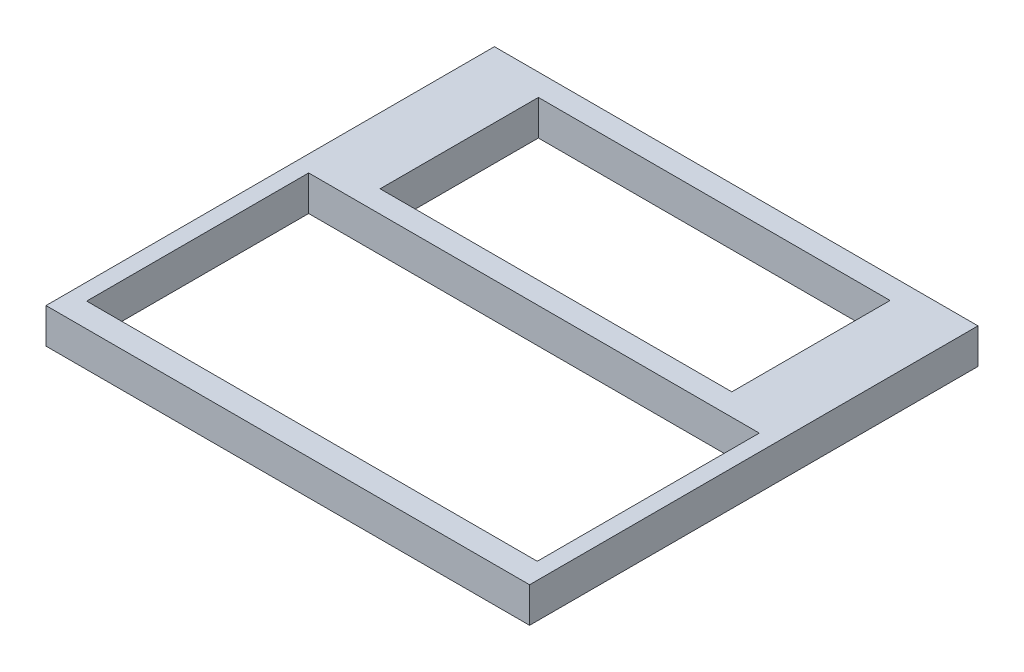
ISO-10303-21;
HEADER;
FILE_DESCRIPTION(('STEP AP214'),'2;1');
FILE_NAME('part.step','',(''),(''),'','','');
FILE_SCHEMA(('AUTOMOTIVE_DESIGN { 1 0 10303 214 1 1 1 1 }'));
ENDSEC;
DATA;
#1=APPLICATION_CONTEXT('core data for automotive mechanical design processes');
#2=APPLICATION_PROTOCOL_DEFINITION('international standard','automotive_design',2000,#1);
#3=PRODUCT_CONTEXT('',#1,'mechanical');
#4=PRODUCT('Part','Part','',(#3));
#5=PRODUCT_RELATED_PRODUCT_CATEGORY('part','',(#4));
#6=PRODUCT_DEFINITION_FORMATION('','',#4);
#7=PRODUCT_DEFINITION_CONTEXT('part definition',#1,'design');
#8=PRODUCT_DEFINITION('design','',#6,#7);
#9=PRODUCT_DEFINITION_SHAPE('','',#8);
#10=(LENGTH_UNIT() NAMED_UNIT(*) SI_UNIT(.MILLI.,.METRE.));
#11=(NAMED_UNIT(*) PLANE_ANGLE_UNIT() SI_UNIT($,.RADIAN.));
#12=(NAMED_UNIT(*) SI_UNIT($,.STERADIAN.) SOLID_ANGLE_UNIT());
#13=UNCERTAINTY_MEASURE_WITH_UNIT(LENGTH_MEASURE(1.E-05),#10,'distance_accuracy_value','');
#14=(GEOMETRIC_REPRESENTATION_CONTEXT(3) GLOBAL_UNCERTAINTY_ASSIGNED_CONTEXT((#13)) GLOBAL_UNIT_ASSIGNED_CONTEXT((#10,
#11,#12)) REPRESENTATION_CONTEXT('',''));
#15=CARTESIAN_POINT('',(0.,0.,0.));
#16=DIRECTION('',(0.,0.,1.));
#17=DIRECTION('',(1.,0.,0.));
#18=AXIS2_PLACEMENT_3D('',#15,#16,#17);
#19=CARTESIAN_POINT('',(0.,8.,0.));
#20=DIRECTION('',(0.,-1.,0.));
#21=DIRECTION('',(0.,0.,-1.));
#22=AXIS2_PLACEMENT_3D('',#19,#20,#21);
#23=PLANE('',#22);
#24=DIRECTION('',(1.,0.,0.));
#25=VECTOR('',#24,1.);
#26=CARTESIAN_POINT('',(-51.25,8.,45.5));
#27=LINE('',#26,#25);
#28=CARTESIAN_POINT('',(-51.25,8.,45.5));
#29=VERTEX_POINT('',#28);
#30=CARTESIAN_POINT('',(51.25,8.,45.5));
#31=VERTEX_POINT('',#30);
#32=EDGE_CURVE('E163',#29,#31,#27,.T.);
#33=ORIENTED_EDGE('',*,*,#32,.F.);
#34=DIRECTION('',(0.,0.,1.));
#35=VECTOR('',#34,1.);
#36=CARTESIAN_POINT('',(-51.25,8.,-5.00000000000001));
#37=LINE('',#36,#35);
#38=CARTESIAN_POINT('',(-51.25,8.,-5.00000000000001));
#39=VERTEX_POINT('',#38);
#40=EDGE_CURVE('E55',#39,#29,#37,.T.);
#41=ORIENTED_EDGE('',*,*,#40,.F.);
#42=DIRECTION('',(-1.,0.,0.));
#43=VECTOR('',#42,1.);
#44=CARTESIAN_POINT('',(-51.25,8.,-5.00000000000001));
#45=LINE('',#44,#43);
#46=CARTESIAN_POINT('',(51.25,8.,-5.00000000000001));
#47=VERTEX_POINT('',#46);
#48=EDGE_CURVE('E150',#47,#39,#45,.T.);
#49=ORIENTED_EDGE('',*,*,#48,.F.);
#50=DIRECTION('',(0.,0.,-1.));
#51=VECTOR('',#50,1.);
#52=CARTESIAN_POINT('',(51.25,8.,-5.00000000000001));
#53=LINE('',#52,#51);
#54=EDGE_CURVE('E154',#31,#47,#53,.T.);
#55=ORIENTED_EDGE('',*,*,#54,.F.);
#56=EDGE_LOOP('',(#33,#41,#49,#55));
#57=FACE_BOUND('',#56,.T.);
#58=DIRECTION('',(0.,0.,-1.));
#59=VECTOR('',#58,1.);
#60=CARTESIAN_POINT('',(55.,8.,51.));
#61=LINE('',#60,#59);
#62=CARTESIAN_POINT('',(55.,8.,51.));
#63=VERTEX_POINT('',#62);
#64=CARTESIAN_POINT('',(55.,8.,-51.));
#65=VERTEX_POINT('',#64);
#66=EDGE_CURVE('E221',#63,#65,#61,.T.);
#67=ORIENTED_EDGE('',*,*,#66,.T.);
#68=DIRECTION('',(-1.,0.,0.));
#69=VECTOR('',#68,1.);
#70=CARTESIAN_POINT('',(-55.,8.,-51.));
#71=LINE('',#70,#69);
#72=CARTESIAN_POINT('',(-55.,8.,-51.));
#73=VERTEX_POINT('',#72);
#74=EDGE_CURVE('E225',#65,#73,#71,.T.);
#75=ORIENTED_EDGE('',*,*,#74,.T.);
#76=DIRECTION('',(0.,0.,1.));
#77=VECTOR('',#76,1.);
#78=CARTESIAN_POINT('',(-55.,8.,51.));
#79=LINE('',#78,#77);
#80=CARTESIAN_POINT('',(-55.,8.,51.));
#81=VERTEX_POINT('',#80);
#82=EDGE_CURVE('E229',#73,#81,#79,.T.);
#83=ORIENTED_EDGE('',*,*,#82,.T.);
#84=DIRECTION('',(1.,0.,0.));
#85=VECTOR('',#84,1.);
#86=CARTESIAN_POINT('',(-55.,8.,51.));
#87=LINE('',#86,#85);
#88=EDGE_CURVE('E232',#81,#63,#87,.T.);
#89=ORIENTED_EDGE('',*,*,#88,.T.);
#90=EDGE_LOOP('',(#67,#75,#83,#89));
#91=FACE_BOUND('',#90,.T.);
#92=DIRECTION('',(0.,0.,1.));
#93=VECTOR('',#92,1.);
#94=CARTESIAN_POINT('',(-40.,8.,-46.));
#95=LINE('',#94,#93);
#96=CARTESIAN_POINT('',(-40.,8.,-46.));
#97=VERTEX_POINT('',#96);
#98=CARTESIAN_POINT('',(-40.,8.,-10.));
#99=VERTEX_POINT('',#98);
#100=EDGE_CURVE('E178',#97,#99,#95,.T.);
#101=ORIENTED_EDGE('',*,*,#100,.F.);
#102=DIRECTION('',(-1.,0.,0.));
#103=VECTOR('',#102,1.);
#104=CARTESIAN_POINT('',(-40.,8.,-46.));
#105=LINE('',#104,#103);
#106=CARTESIAN_POINT('',(40.,8.,-46.));
#107=VERTEX_POINT('',#106);
#108=EDGE_CURVE('E189',#107,#97,#105,.T.);
#109=ORIENTED_EDGE('',*,*,#108,.F.);
#110=DIRECTION('',(0.,0.,-1.));
#111=VECTOR('',#110,1.);
#112=CARTESIAN_POINT('',(40.,8.,-46.));
#113=LINE('',#112,#111);
#114=CARTESIAN_POINT('',(40.,8.,-10.));
#115=VERTEX_POINT('',#114);
#116=EDGE_CURVE('E185',#115,#107,#113,.T.);
#117=ORIENTED_EDGE('',*,*,#116,.F.);
#118=DIRECTION('',(1.,0.,0.));
#119=VECTOR('',#118,1.);
#120=CARTESIAN_POINT('',(-40.,8.,-10.));
#121=LINE('',#120,#119);
#122=EDGE_CURVE('E181',#99,#115,#121,.T.);
#123=ORIENTED_EDGE('',*,*,#122,.F.);
#124=EDGE_LOOP('',(#101,#109,#117,#123));
#125=FACE_BOUND('',#124,.T.);
#126=ADVANCED_FACE('F39',(#57,#91,#125),#23,.F.);
#127=CARTESIAN_POINT('',(0.,0.,0.));
#128=DIRECTION('',(0.,-1.,0.));
#129=DIRECTION('',(0.,0.,-1.));
#130=AXIS2_PLACEMENT_3D('',#127,#128,#129);
#131=PLANE('',#130);
#132=DIRECTION('',(0.,0.,1.));
#133=VECTOR('',#132,1.);
#134=CARTESIAN_POINT('',(-51.25,0.,-5.00000000000001));
#135=LINE('',#134,#133);
#136=CARTESIAN_POINT('',(-51.25,0.,-5.00000000000001));
#137=VERTEX_POINT('',#136);
#138=CARTESIAN_POINT('',(-51.25,0.,45.5));
#139=VERTEX_POINT('',#138);
#140=EDGE_CURVE('E131',#137,#139,#135,.T.);
#141=ORIENTED_EDGE('',*,*,#140,.T.);
#142=DIRECTION('',(1.,0.,0.));
#143=VECTOR('',#142,1.);
#144=CARTESIAN_POINT('',(-51.25,0.,45.5));
#145=LINE('',#144,#143);
#146=CARTESIAN_POINT('',(51.25,0.,45.5));
#147=VERTEX_POINT('',#146);
#148=EDGE_CURVE('E141',#139,#147,#145,.T.);
#149=ORIENTED_EDGE('',*,*,#148,.T.);
#150=DIRECTION('',(0.,0.,-1.));
#151=VECTOR('',#150,1.);
#152=CARTESIAN_POINT('',(51.25,0.,-5.00000000000001));
#153=LINE('',#152,#151);
#154=CARTESIAN_POINT('',(51.25,0.,-5.00000000000001));
#155=VERTEX_POINT('',#154);
#156=EDGE_CURVE('E63',#147,#155,#153,.T.);
#157=ORIENTED_EDGE('',*,*,#156,.T.);
#158=DIRECTION('',(-1.,0.,0.));
#159=VECTOR('',#158,1.);
#160=CARTESIAN_POINT('',(-51.25,0.,-5.00000000000001));
#161=LINE('',#160,#159);
#162=EDGE_CURVE('E138',#155,#137,#161,.T.);
#163=ORIENTED_EDGE('',*,*,#162,.T.);
#164=EDGE_LOOP('',(#141,#149,#157,#163));
#165=FACE_BOUND('',#164,.T.);
#166=DIRECTION('',(0.,0.,-1.));
#167=VECTOR('',#166,1.);
#168=CARTESIAN_POINT('',(55.,0.,51.));
#169=LINE('',#168,#167);
#170=CARTESIAN_POINT('',(55.,0.,51.));
#171=VERTEX_POINT('',#170);
#172=CARTESIAN_POINT('',(55.,0.,-51.));
#173=VERTEX_POINT('',#172);
#174=EDGE_CURVE('E220',#171,#173,#169,.T.);
#175=ORIENTED_EDGE('',*,*,#174,.F.);
#176=DIRECTION('',(1.,0.,0.));
#177=VECTOR('',#176,1.);
#178=CARTESIAN_POINT('',(-55.,0.,51.));
#179=LINE('',#178,#177);
#180=CARTESIAN_POINT('',(-55.,0.,51.));
#181=VERTEX_POINT('',#180);
#182=EDGE_CURVE('E226',#181,#171,#179,.T.);
#183=ORIENTED_EDGE('',*,*,#182,.F.);
#184=DIRECTION('',(0.,0.,1.));
#185=VECTOR('',#184,1.);
#186=CARTESIAN_POINT('',(-55.,0.,51.));
#187=LINE('',#186,#185);
#188=CARTESIAN_POINT('',(-55.,0.,-51.));
#189=VERTEX_POINT('',#188);
#190=EDGE_CURVE('E242',#189,#181,#187,.T.);
#191=ORIENTED_EDGE('',*,*,#190,.F.);
#192=DIRECTION('',(-1.,0.,0.));
#193=VECTOR('',#192,1.);
#194=CARTESIAN_POINT('',(-55.,0.,-51.));
#195=LINE('',#194,#193);
#196=EDGE_CURVE('E239',#173,#189,#195,.T.);
#197=ORIENTED_EDGE('',*,*,#196,.F.);
#198=EDGE_LOOP('',(#175,#183,#191,#197));
#199=FACE_BOUND('',#198,.T.);
#200=DIRECTION('',(-1.,0.,0.));
#201=VECTOR('',#200,1.);
#202=CARTESIAN_POINT('',(-40.,0.,-46.));
#203=LINE('',#202,#201);
#204=CARTESIAN_POINT('',(40.,0.,-46.));
#205=VERTEX_POINT('',#204);
#206=CARTESIAN_POINT('',(-40.,0.,-46.));
#207=VERTEX_POINT('',#206);
#208=EDGE_CURVE('E182',#205,#207,#203,.T.);
#209=ORIENTED_EDGE('',*,*,#208,.T.);
#210=DIRECTION('',(0.,0.,1.));
#211=VECTOR('',#210,1.);
#212=CARTESIAN_POINT('',(-40.,0.,-46.));
#213=LINE('',#212,#211);
#214=CARTESIAN_POINT('',(-40.,0.,-10.));
#215=VERTEX_POINT('',#214);
#216=EDGE_CURVE('E172',#207,#215,#213,.T.);
#217=ORIENTED_EDGE('',*,*,#216,.T.);
#218=DIRECTION('',(1.,0.,0.));
#219=VECTOR('',#218,1.);
#220=CARTESIAN_POINT('',(-40.,0.,-10.));
#221=LINE('',#220,#219);
#222=CARTESIAN_POINT('',(40.,0.,-10.));
#223=VERTEX_POINT('',#222);
#224=EDGE_CURVE('E196',#215,#223,#221,.T.);
#225=ORIENTED_EDGE('',*,*,#224,.T.);
#226=DIRECTION('',(0.,0.,-1.));
#227=VECTOR('',#226,1.);
#228=CARTESIAN_POINT('',(40.,0.,-46.));
#229=LINE('',#228,#227);
#230=EDGE_CURVE('E200',#223,#205,#229,.T.);
#231=ORIENTED_EDGE('',*,*,#230,.T.);
#232=EDGE_LOOP('',(#209,#217,#225,#231));
#233=FACE_BOUND('',#232,.T.);
#234=ADVANCED_FACE('F146',(#165,#199,#233),#131,.T.);
#235=CARTESIAN_POINT('',(55.,8.,51.));
#236=DIRECTION('',(-1.,0.,0.));
#237=DIRECTION('',(0.,0.,1.));
#238=AXIS2_PLACEMENT_3D('',#235,#236,#237);
#239=PLANE('',#238);
#240=ORIENTED_EDGE('',*,*,#174,.T.);
#241=DIRECTION('',(0.,-1.,0.));
#242=VECTOR('',#241,1.);
#243=CARTESIAN_POINT('',(55.,8.,-51.));
#244=LINE('',#243,#242);
#245=EDGE_CURVE('E11',#65,#173,#244,.T.);
#246=ORIENTED_EDGE('',*,*,#245,.F.);
#247=ORIENTED_EDGE('',*,*,#66,.F.);
#248=DIRECTION('',(0.,-1.,0.));
#249=VECTOR('',#248,1.);
#250=CARTESIAN_POINT('',(55.,8.,51.));
#251=LINE('',#250,#249);
#252=EDGE_CURVE('E235',#63,#171,#251,.T.);
#253=ORIENTED_EDGE('',*,*,#252,.T.);
#254=EDGE_LOOP('',(#240,#246,#247,#253));
#255=FACE_BOUND('',#254,.T.);
#256=ADVANCED_FACE('F41',(#255),#239,.F.);
#257=CARTESIAN_POINT('',(-55.,8.,-51.));
#258=DIRECTION('',(0.,0.,1.));
#259=DIRECTION('',(1.,0.,0.));
#260=AXIS2_PLACEMENT_3D('',#257,#258,#259);
#261=PLANE('',#260);
#262=ORIENTED_EDGE('',*,*,#196,.T.);
#263=DIRECTION('',(0.,-1.,0.));
#264=VECTOR('',#263,1.);
#265=CARTESIAN_POINT('',(-55.,8.,-51.));
#266=LINE('',#265,#264);
#267=EDGE_CURVE('E48',#73,#189,#266,.T.);
#268=ORIENTED_EDGE('',*,*,#267,.F.);
#269=ORIENTED_EDGE('',*,*,#74,.F.);
#270=ORIENTED_EDGE('',*,*,#245,.T.);
#271=EDGE_LOOP('',(#262,#268,#269,#270));
#272=FACE_BOUND('',#271,.T.);
#273=ADVANCED_FACE('F274',(#272),#261,.F.);
#274=CARTESIAN_POINT('',(-55.,8.,51.));
#275=DIRECTION('',(1.,0.,0.));
#276=DIRECTION('',(0.,0.,-1.));
#277=AXIS2_PLACEMENT_3D('',#274,#275,#276);
#278=PLANE('',#277);
#279=ORIENTED_EDGE('',*,*,#190,.T.);
#280=DIRECTION('',(0.,-1.,0.));
#281=VECTOR('',#280,1.);
#282=CARTESIAN_POINT('',(-55.,8.,51.));
#283=LINE('',#282,#281);
#284=EDGE_CURVE('E250',#81,#181,#283,.T.);
#285=ORIENTED_EDGE('',*,*,#284,.F.);
#286=ORIENTED_EDGE('',*,*,#82,.F.);
#287=ORIENTED_EDGE('',*,*,#267,.T.);
#288=EDGE_LOOP('',(#279,#285,#286,#287));
#289=FACE_BOUND('',#288,.T.);
#290=ADVANCED_FACE('F259',(#289),#278,.F.);
#291=CARTESIAN_POINT('',(-55.,8.,51.));
#292=DIRECTION('',(0.,0.,-1.));
#293=DIRECTION('',(-1.,0.,0.));
#294=AXIS2_PLACEMENT_3D('',#291,#292,#293);
#295=PLANE('',#294);
#296=ORIENTED_EDGE('',*,*,#182,.T.);
#297=ORIENTED_EDGE('',*,*,#252,.F.);
#298=ORIENTED_EDGE('',*,*,#88,.F.);
#299=ORIENTED_EDGE('',*,*,#284,.T.);
#300=EDGE_LOOP('',(#296,#297,#298,#299));
#301=FACE_BOUND('',#300,.T.);
#302=ADVANCED_FACE('F267',(#301),#295,.F.);
#303=CARTESIAN_POINT('',(-40.,8.,-46.));
#304=DIRECTION('',(1.,0.,0.));
#305=DIRECTION('',(0.,0.,-1.));
#306=AXIS2_PLACEMENT_3D('',#303,#304,#305);
#307=PLANE('',#306);
#308=ORIENTED_EDGE('',*,*,#216,.F.);
#309=DIRECTION('',(0.,-1.,0.));
#310=VECTOR('',#309,1.);
#311=CARTESIAN_POINT('',(-40.,8.,-46.));
#312=LINE('',#311,#310);
#313=EDGE_CURVE('E192',#97,#207,#312,.T.);
#314=ORIENTED_EDGE('',*,*,#313,.F.);
#315=ORIENTED_EDGE('',*,*,#100,.T.);
#316=DIRECTION('',(0.,-1.,0.));
#317=VECTOR('',#316,1.);
#318=CARTESIAN_POINT('',(-40.,8.,-10.));
#319=LINE('',#318,#317);
#320=EDGE_CURVE('E216',#99,#215,#319,.T.);
#321=ORIENTED_EDGE('',*,*,#320,.T.);
#322=EDGE_LOOP('',(#308,#314,#315,#321));
#323=FACE_BOUND('',#322,.T.);
#324=ADVANCED_FACE('F289',(#323),#307,.T.);
#325=CARTESIAN_POINT('',(-40.,8.,-10.));
#326=DIRECTION('',(0.,0.,-1.));
#327=DIRECTION('',(-1.,0.,0.));
#328=AXIS2_PLACEMENT_3D('',#325,#326,#327);
#329=PLANE('',#328);
#330=ORIENTED_EDGE('',*,*,#224,.F.);
#331=ORIENTED_EDGE('',*,*,#320,.F.);
#332=ORIENTED_EDGE('',*,*,#122,.T.);
#333=DIRECTION('',(0.,-1.,0.));
#334=VECTOR('',#333,1.);
#335=CARTESIAN_POINT('',(40.,8.,-10.));
#336=LINE('',#335,#334);
#337=EDGE_CURVE('E213',#115,#223,#336,.T.);
#338=ORIENTED_EDGE('',*,*,#337,.T.);
#339=EDGE_LOOP('',(#330,#331,#332,#338));
#340=FACE_BOUND('',#339,.T.);
#341=ADVANCED_FACE('F296',(#340),#329,.T.);
#342=CARTESIAN_POINT('',(40.,8.,-46.));
#343=DIRECTION('',(-1.,0.,0.));
#344=DIRECTION('',(0.,0.,1.));
#345=AXIS2_PLACEMENT_3D('',#342,#343,#344);
#346=PLANE('',#345);
#347=ORIENTED_EDGE('',*,*,#230,.F.);
#348=ORIENTED_EDGE('',*,*,#337,.F.);
#349=ORIENTED_EDGE('',*,*,#116,.T.);
#350=DIRECTION('',(0.,-1.,0.));
#351=VECTOR('',#350,1.);
#352=CARTESIAN_POINT('',(40.,8.,-46.));
#353=LINE('',#352,#351);
#354=EDGE_CURVE('E210',#107,#205,#353,.T.);
#355=ORIENTED_EDGE('',*,*,#354,.T.);
#356=EDGE_LOOP('',(#347,#348,#349,#355));
#357=FACE_BOUND('',#356,.T.);
#358=ADVANCED_FACE('F301',(#357),#346,.T.);
#359=CARTESIAN_POINT('',(-40.,8.,-46.));
#360=DIRECTION('',(0.,0.,1.));
#361=DIRECTION('',(1.,0.,0.));
#362=AXIS2_PLACEMENT_3D('',#359,#360,#361);
#363=PLANE('',#362);
#364=ORIENTED_EDGE('',*,*,#208,.F.);
#365=ORIENTED_EDGE('',*,*,#354,.F.);
#366=ORIENTED_EDGE('',*,*,#108,.T.);
#367=ORIENTED_EDGE('',*,*,#313,.T.);
#368=EDGE_LOOP('',(#364,#365,#366,#367));
#369=FACE_BOUND('',#368,.T.);
#370=ADVANCED_FACE('F308',(#369),#363,.T.);
#371=CARTESIAN_POINT('',(-51.25,0.,-5.00000000000001));
#372=DIRECTION('',(-1.,0.,0.));
#373=DIRECTION('',(0.,0.,1.));
#374=AXIS2_PLACEMENT_3D('',#371,#372,#373);
#375=PLANE('',#374);
#376=ORIENTED_EDGE('',*,*,#40,.T.);
#377=DIRECTION('',(0.,1.,0.));
#378=VECTOR('',#377,1.);
#379=CARTESIAN_POINT('',(-51.25,0.,45.5));
#380=LINE('',#379,#378);
#381=EDGE_CURVE('E127',#139,#29,#380,.T.);
#382=ORIENTED_EDGE('',*,*,#381,.F.);
#383=ORIENTED_EDGE('',*,*,#140,.F.);
#384=DIRECTION('',(0.,1.,0.));
#385=VECTOR('',#384,1.);
#386=CARTESIAN_POINT('',(-51.25,0.,-5.00000000000001));
#387=LINE('',#386,#385);
#388=EDGE_CURVE('E169',#137,#39,#387,.T.);
#389=ORIENTED_EDGE('',*,*,#388,.T.);
#390=EDGE_LOOP('',(#376,#382,#383,#389));
#391=FACE_BOUND('',#390,.T.);
#392=ADVANCED_FACE('F129',(#391),#375,.F.);
#393=CARTESIAN_POINT('',(-51.25,0.,-5.00000000000001));
#394=DIRECTION('',(0.,0.,-1.));
#395=DIRECTION('',(-1.,0.,0.));
#396=AXIS2_PLACEMENT_3D('',#393,#394,#395);
#397=PLANE('',#396);
#398=ORIENTED_EDGE('',*,*,#48,.T.);
#399=ORIENTED_EDGE('',*,*,#388,.F.);
#400=ORIENTED_EDGE('',*,*,#162,.F.);
#401=DIRECTION('',(0.,1.,0.));
#402=VECTOR('',#401,1.);
#403=CARTESIAN_POINT('',(51.25,0.,-5.00000000000001));
#404=LINE('',#403,#402);
#405=EDGE_CURVE('E173',#155,#47,#404,.T.);
#406=ORIENTED_EDGE('',*,*,#405,.T.);
#407=EDGE_LOOP('',(#398,#399,#400,#406));
#408=FACE_BOUND('',#407,.T.);
#409=ADVANCED_FACE('F324',(#408),#397,.F.);
#410=CARTESIAN_POINT('',(51.25,0.,-5.00000000000001));
#411=DIRECTION('',(1.,0.,0.));
#412=DIRECTION('',(0.,0.,-1.));
#413=AXIS2_PLACEMENT_3D('',#410,#411,#412);
#414=PLANE('',#413);
#415=ORIENTED_EDGE('',*,*,#54,.T.);
#416=ORIENTED_EDGE('',*,*,#405,.F.);
#417=ORIENTED_EDGE('',*,*,#156,.F.);
#418=DIRECTION('',(0.,1.,0.));
#419=VECTOR('',#418,1.);
#420=CARTESIAN_POINT('',(51.25,0.,45.5));
#421=LINE('',#420,#419);
#422=EDGE_CURVE('E137',#147,#31,#421,.T.);
#423=ORIENTED_EDGE('',*,*,#422,.T.);
#424=EDGE_LOOP('',(#415,#416,#417,#423));
#425=FACE_BOUND('',#424,.T.);
#426=ADVANCED_FACE('F327',(#425),#414,.F.);
#427=CARTESIAN_POINT('',(-51.25,0.,45.5));
#428=DIRECTION('',(0.,0.,1.));
#429=DIRECTION('',(1.,0.,0.));
#430=AXIS2_PLACEMENT_3D('',#427,#428,#429);
#431=PLANE('',#430);
#432=ORIENTED_EDGE('',*,*,#32,.T.);
#433=ORIENTED_EDGE('',*,*,#422,.F.);
#434=ORIENTED_EDGE('',*,*,#148,.F.);
#435=ORIENTED_EDGE('',*,*,#381,.T.);
#436=EDGE_LOOP('',(#432,#433,#434,#435));
#437=FACE_BOUND('',#436,.T.);
#438=ADVANCED_FACE('F142',(#437),#431,.F.);
#439=CLOSED_SHELL('',(#126,#234,#256,#273,#290,#302,#324,#341,#358,#370,#392,#409,#426,#438));
#440=MANIFOLD_SOLID_BREP('B2',#439);
#441=ADVANCED_BREP_SHAPE_REPRESENTATION('',(#18,#440),#14);
#442=SHAPE_DEFINITION_REPRESENTATION(#9,#441);
ENDSEC;
END-ISO-10303-21;
